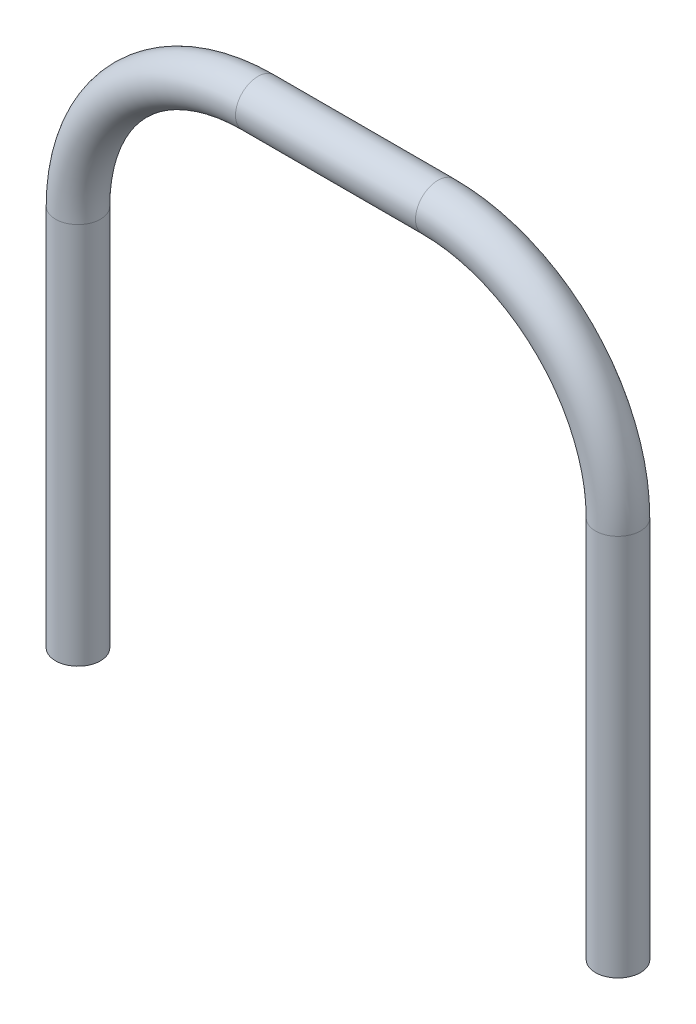
ISO-10303-21;
HEADER;
FILE_DESCRIPTION(('STEP AP214'),'2;1');
FILE_NAME('part.step','',(''),(''),'','','');
FILE_SCHEMA(('AUTOMOTIVE_DESIGN { 1 0 10303 214 1 1 1 1 }'));
ENDSEC;
DATA;
#1=APPLICATION_CONTEXT('core data for automotive mechanical design processes');
#2=APPLICATION_PROTOCOL_DEFINITION('international standard','automotive_design',2000,#1);
#3=PRODUCT_CONTEXT('',#1,'mechanical');
#4=PRODUCT('Part','Part','',(#3));
#5=PRODUCT_RELATED_PRODUCT_CATEGORY('part','',(#4));
#6=PRODUCT_DEFINITION_FORMATION('','',#4);
#7=PRODUCT_DEFINITION_CONTEXT('part definition',#1,'design');
#8=PRODUCT_DEFINITION('design','',#6,#7);
#9=PRODUCT_DEFINITION_SHAPE('','',#8);
#10=(LENGTH_UNIT() NAMED_UNIT(*) SI_UNIT(.MILLI.,.METRE.));
#11=(NAMED_UNIT(*) PLANE_ANGLE_UNIT() SI_UNIT($,.RADIAN.));
#12=(NAMED_UNIT(*) SI_UNIT($,.STERADIAN.) SOLID_ANGLE_UNIT());
#13=UNCERTAINTY_MEASURE_WITH_UNIT(LENGTH_MEASURE(1.E-05),#10,'distance_accuracy_value','');
#14=(GEOMETRIC_REPRESENTATION_CONTEXT(3) GLOBAL_UNCERTAINTY_ASSIGNED_CONTEXT((#13)) GLOBAL_UNIT_ASSIGNED_CONTEXT((#10,
#11,#12)) REPRESENTATION_CONTEXT('',''));
#15=CARTESIAN_POINT('',(0.,0.,0.));
#16=DIRECTION('',(0.,0.,1.));
#17=DIRECTION('',(1.,0.,0.));
#18=AXIS2_PLACEMENT_3D('',#15,#16,#17);
#19=CARTESIAN_POINT('',(609.6,431.8,0.));
#20=DIRECTION('',(0.,-1.,0.));
#21=DIRECTION('',(1.,0.,0.));
#22=AXIS2_PLACEMENT_3D('',#19,#20,#21);
#23=CYLINDRICAL_SURFACE('',#22,25.4);
#24=CARTESIAN_POINT('',(609.6,431.8,0.));
#25=DIRECTION('',(0.,-1.,0.));
#26=DIRECTION('',(0.,0.,1.));
#27=AXIS2_PLACEMENT_3D('',#24,#25,#26);
#28=CIRCLE('',#27,25.4);
#29=CARTESIAN_POINT('',(635.,431.8,0.));
#30=VERTEX_POINT('',#29);
#31=EDGE_CURVE('E40',#30,#30,#28,.T.);
#32=ORIENTED_EDGE('',*,*,#31,.T.);
#33=EDGE_LOOP('',(#32));
#34=FACE_BOUND('',#33,.T.);
#35=CARTESIAN_POINT('',(609.6,1.11022302462516E-13,0.));
#36=DIRECTION('',(0.,-1.,0.));
#37=DIRECTION('',(0.,0.,1.));
#38=AXIS2_PLACEMENT_3D('',#35,#36,#37);
#39=CIRCLE('',#38,25.4);
#40=CARTESIAN_POINT('',(609.6,1.11022302462516E-13,25.4));
#41=VERTEX_POINT('',#40);
#42=EDGE_CURVE('E10',#41,#41,#39,.T.);
#43=ORIENTED_EDGE('',*,*,#42,.F.);
#44=EDGE_LOOP('',(#43));
#45=FACE_BOUND('',#44,.T.);
#46=ADVANCED_FACE('F34',(#34,#45),#23,.T.);
#47=CARTESIAN_POINT('',(406.4,431.8,0.));
#48=DIRECTION('',(0.,0.,-1.));
#49=DIRECTION('',(-1.,0.,0.));
#50=AXIS2_PLACEMENT_3D('',#47,#48,#49);
#51=TOROIDAL_SURFACE('',#50,203.2,25.4);
#52=CARTESIAN_POINT('',(406.4,635.,0.));
#53=DIRECTION('',(1.,0.,0.));
#54=DIRECTION('',(0.,0.,1.));
#55=AXIS2_PLACEMENT_3D('',#52,#53,#54);
#56=CIRCLE('',#55,25.4);
#57=CARTESIAN_POINT('',(406.4,660.4,0.));
#58=VERTEX_POINT('',#57);
#59=EDGE_CURVE('E44',#58,#58,#56,.T.);
#60=CARTESIAN_POINT('',(406.4,431.8,0.));
#61=DIRECTION('',(0.,0.,-1.));
#62=DIRECTION('',(-1.,0.,0.));
#63=AXIS2_PLACEMENT_3D('',#60,#61,#62);
#64=CIRCLE('',#63,228.6);
#65=EDGE_CURVE('',#58,#30,#64,.T.);
#66=ORIENTED_EDGE('',*,*,#59,.T.);
#67=ORIENTED_EDGE('',*,*,#31,.F.);
#68=ORIENTED_EDGE('',*,*,#65,.T.);
#69=ORIENTED_EDGE('',*,*,#65,.F.);
#70=EDGE_LOOP('',(#66,#68,#67,#69));
#71=FACE_BOUND('',#70,.T.);
#72=ADVANCED_FACE('F90',(#71),#51,.T.);
#73=CARTESIAN_POINT('',(203.2,635.,0.));
#74=DIRECTION('',(1.,0.,0.));
#75=DIRECTION('',(0.,0.,-1.));
#76=AXIS2_PLACEMENT_3D('',#73,#74,#75);
#77=CYLINDRICAL_SURFACE('',#76,25.4);
#78=CARTESIAN_POINT('',(203.2,635.,0.));
#79=DIRECTION('',(1.,0.,0.));
#80=DIRECTION('',(0.,0.,1.));
#81=AXIS2_PLACEMENT_3D('',#78,#79,#80);
#82=CIRCLE('',#81,25.4);
#83=CARTESIAN_POINT('',(203.2,660.4,0.));
#84=VERTEX_POINT('',#83);
#85=EDGE_CURVE('E48',#84,#84,#82,.T.);
#86=ORIENTED_EDGE('',*,*,#85,.T.);
#87=EDGE_LOOP('',(#86));
#88=FACE_BOUND('',#87,.T.);
#89=ORIENTED_EDGE('',*,*,#59,.F.);
#90=EDGE_LOOP('',(#89));
#91=FACE_BOUND('',#90,.T.);
#92=ADVANCED_FACE('F94',(#88,#91),#77,.T.);
#93=CARTESIAN_POINT('',(203.2,431.8,0.));
#94=DIRECTION('',(0.,0.,-1.));
#95=DIRECTION('',(-1.,0.,0.));
#96=AXIS2_PLACEMENT_3D('',#93,#94,#95);
#97=TOROIDAL_SURFACE('',#96,203.2,25.4);
#98=CARTESIAN_POINT('',(0.,431.8,0.));
#99=DIRECTION('',(0.,1.,0.));
#100=DIRECTION('',(0.,0.,1.));
#101=AXIS2_PLACEMENT_3D('',#98,#99,#100);
#102=CIRCLE('',#101,25.4);
#103=CARTESIAN_POINT('',(-25.4,431.8,0.));
#104=VERTEX_POINT('',#103);
#105=EDGE_CURVE('E53',#104,#104,#102,.T.);
#106=CARTESIAN_POINT('',(203.2,431.8,0.));
#107=DIRECTION('',(0.,0.,-1.));
#108=DIRECTION('',(-1.,0.,0.));
#109=AXIS2_PLACEMENT_3D('',#106,#107,#108);
#110=CIRCLE('',#109,228.6);
#111=EDGE_CURVE('',#104,#84,#110,.T.);
#112=ORIENTED_EDGE('',*,*,#105,.T.);
#113=ORIENTED_EDGE('',*,*,#85,.F.);
#114=ORIENTED_EDGE('',*,*,#111,.T.);
#115=ORIENTED_EDGE('',*,*,#111,.F.);
#116=EDGE_LOOP('',(#112,#114,#113,#115));
#117=FACE_BOUND('',#116,.T.);
#118=ADVANCED_FACE('F86',(#117),#97,.T.);
#119=CARTESIAN_POINT('',(0.,431.8,0.));
#120=DIRECTION('',(0.,-1.,0.));
#121=DIRECTION('',(0.,0.,-1.));
#122=AXIS2_PLACEMENT_3D('',#119,#120,#121);
#123=CYLINDRICAL_SURFACE('',#122,25.4);
#124=ORIENTED_EDGE('',*,*,#105,.F.);
#125=EDGE_LOOP('',(#124));
#126=FACE_BOUND('',#125,.T.);
#127=CARTESIAN_POINT('',(0.,0.,0.));
#128=DIRECTION('',(0.,1.,0.));
#129=DIRECTION('',(0.,0.,1.));
#130=AXIS2_PLACEMENT_3D('',#127,#128,#129);
#131=CIRCLE('',#130,25.4);
#132=CARTESIAN_POINT('',(0.,0.,25.4));
#133=VERTEX_POINT('',#132);
#134=EDGE_CURVE('E56',#133,#133,#131,.T.);
#135=ORIENTED_EDGE('',*,*,#134,.T.);
#136=EDGE_LOOP('',(#135));
#137=FACE_BOUND('',#136,.T.);
#138=ADVANCED_FACE('F77',(#126,#137),#123,.T.);
#139=CARTESIAN_POINT('',(609.6,1.11022302462516E-13,0.));
#140=DIRECTION('',(0.,-1.,0.));
#141=DIRECTION('',(0.,0.,1.));
#142=AXIS2_PLACEMENT_3D('',#139,#140,#141);
#143=PLANE('',#142);
#144=CARTESIAN_POINT('',(609.6,0.,0.));
#145=DIRECTION('',(0.,-1.,0.));
#146=DIRECTION('',(1.,0.,0.));
#147=AXIS2_PLACEMENT_3D('',#144,#145,#146);
#148=CIRCLE('',#147,23.749);
#149=CARTESIAN_POINT('',(633.349,0.,0.));
#150=VERTEX_POINT('',#149);
#151=EDGE_CURVE('E68',#150,#150,#148,.T.);
#152=ORIENTED_EDGE('',*,*,#151,.F.);
#153=EDGE_LOOP('',(#152));
#154=FACE_BOUND('',#153,.T.);
#155=ORIENTED_EDGE('',*,*,#42,.T.);
#156=EDGE_LOOP('',(#155));
#157=FACE_BOUND('',#156,.T.);
#158=ADVANCED_FACE('F74',(#154,#157),#143,.T.);
#159=CARTESIAN_POINT('',(0.,0.,0.));
#160=DIRECTION('',(0.,1.,0.));
#161=DIRECTION('',(0.,0.,1.));
#162=AXIS2_PLACEMENT_3D('',#159,#160,#161);
#163=PLANE('',#162);
#164=CARTESIAN_POINT('',(0.,0.,0.));
#165=DIRECTION('',(0.,-1.,0.));
#166=DIRECTION('',(0.,0.,-1.));
#167=AXIS2_PLACEMENT_3D('',#164,#165,#166);
#168=CIRCLE('',#167,23.749);
#169=CARTESIAN_POINT('',(0.,0.,-23.749));
#170=VERTEX_POINT('',#169);
#171=EDGE_CURVE('E62',#170,#170,#168,.T.);
#172=ORIENTED_EDGE('',*,*,#171,.F.);
#173=EDGE_LOOP('',(#172));
#174=FACE_BOUND('',#173,.T.);
#175=ORIENTED_EDGE('',*,*,#134,.F.);
#176=EDGE_LOOP('',(#175));
#177=FACE_BOUND('',#176,.T.);
#178=ADVANCED_FACE('F76',(#174,#177),#163,.F.);
#179=CARTESIAN_POINT('',(0.,363.219999999999,0.));
#180=DIRECTION('',(0.,-1.,0.));
#181=DIRECTION('',(0.,0.,-1.));
#182=AXIS2_PLACEMENT_3D('',#179,#180,#181);
#183=CYLINDRICAL_SURFACE('',#182,23.749);
#184=CARTESIAN_POINT('',(0.,363.219999999999,0.));
#185=DIRECTION('',(0.,-1.,0.));
#186=DIRECTION('',(0.,0.,-1.));
#187=AXIS2_PLACEMENT_3D('',#184,#185,#186);
#188=CIRCLE('',#187,23.749);
#189=CARTESIAN_POINT('',(0.,363.219999999999,-23.749));
#190=VERTEX_POINT('',#189);
#191=EDGE_CURVE('E59',#190,#190,#188,.T.);
#192=ORIENTED_EDGE('',*,*,#191,.F.);
#193=EDGE_LOOP('',(#192));
#194=FACE_BOUND('',#193,.T.);
#195=ORIENTED_EDGE('',*,*,#171,.T.);
#196=EDGE_LOOP('',(#195));
#197=FACE_BOUND('',#196,.T.);
#198=ADVANCED_FACE('F83',(#194,#197),#183,.F.);
#199=CARTESIAN_POINT('',(0.,363.219999999999,0.));
#200=DIRECTION('',(0.,-1.,0.));
#201=DIRECTION('',(0.,0.,-1.));
#202=AXIS2_PLACEMENT_3D('',#199,#200,#201);
#203=PLANE('',#202);
#204=ORIENTED_EDGE('',*,*,#191,.T.);
#205=EDGE_LOOP('',(#204));
#206=FACE_BOUND('',#205,.T.);
#207=ADVANCED_FACE('F138',(#206),#203,.T.);
#208=CARTESIAN_POINT('',(609.6,401.319999999999,0.));
#209=DIRECTION('',(0.,-1.,0.));
#210=DIRECTION('',(1.,0.,0.));
#211=AXIS2_PLACEMENT_3D('',#208,#209,#210);
#212=CYLINDRICAL_SURFACE('',#211,23.749);
#213=CARTESIAN_POINT('',(609.6,401.319999999999,0.));
#214=DIRECTION('',(0.,-1.,0.));
#215=DIRECTION('',(1.,0.,0.));
#216=AXIS2_PLACEMENT_3D('',#213,#214,#215);
#217=CIRCLE('',#216,23.749);
#218=CARTESIAN_POINT('',(633.349,401.319999999999,0.));
#219=VERTEX_POINT('',#218);
#220=EDGE_CURVE('E65',#219,#219,#217,.T.);
#221=ORIENTED_EDGE('',*,*,#220,.F.);
#222=EDGE_LOOP('',(#221));
#223=FACE_BOUND('',#222,.T.);
#224=ORIENTED_EDGE('',*,*,#151,.T.);
#225=EDGE_LOOP('',(#224));
#226=FACE_BOUND('',#225,.T.);
#227=ADVANCED_FACE('F72',(#223,#226),#212,.F.);
#228=CARTESIAN_POINT('',(609.6,401.319999999999,0.));
#229=DIRECTION('',(0.,-1.,0.));
#230=DIRECTION('',(1.,0.,0.));
#231=AXIS2_PLACEMENT_3D('',#228,#229,#230);
#232=PLANE('',#231);
#233=ORIENTED_EDGE('',*,*,#220,.T.);
#234=EDGE_LOOP('',(#233));
#235=FACE_BOUND('',#234,.T.);
#236=ADVANCED_FACE('F160',(#235),#232,.T.);
#237=CLOSED_SHELL('',(#46,#72,#92,#118,#138,#158,#178,#198,#207,#227,#236));
#238=MANIFOLD_SOLID_BREP('B2',#237);
#239=ADVANCED_BREP_SHAPE_REPRESENTATION('',(#18,#238),#14);
#240=SHAPE_DEFINITION_REPRESENTATION(#9,#239);
ENDSEC;
END-ISO-10303-21;
